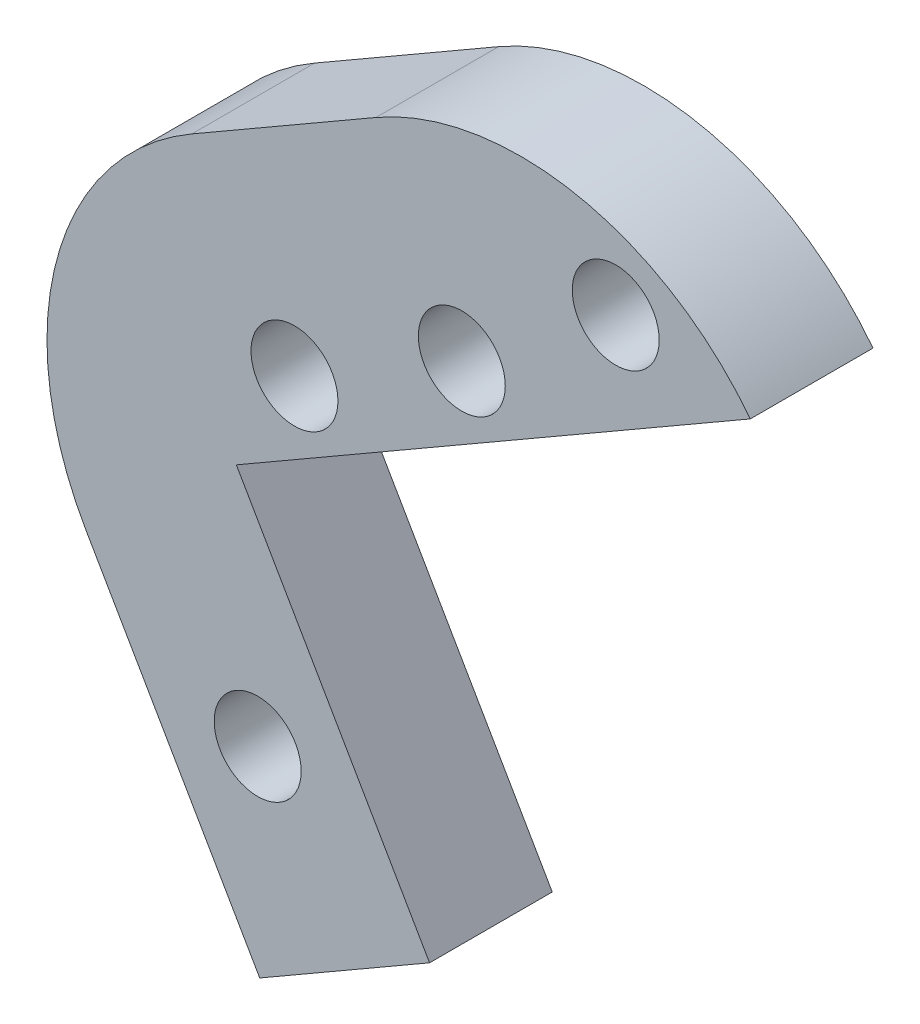
ISO-10303-21;
HEADER;
FILE_DESCRIPTION(('STEP AP214'),'2;1');
FILE_NAME('part.step','',(''),(''),'','','');
FILE_SCHEMA(('AUTOMOTIVE_DESIGN { 1 0 10303 214 1 1 1 1 }'));
ENDSEC;
DATA;
#1=APPLICATION_CONTEXT('core data for automotive mechanical design processes');
#2=APPLICATION_PROTOCOL_DEFINITION('international standard','automotive_design',2000,#1);
#3=PRODUCT_CONTEXT('',#1,'mechanical');
#4=PRODUCT('Part','Part','',(#3));
#5=PRODUCT_RELATED_PRODUCT_CATEGORY('part','',(#4));
#6=PRODUCT_DEFINITION_FORMATION('','',#4);
#7=PRODUCT_DEFINITION_CONTEXT('part definition',#1,'design');
#8=PRODUCT_DEFINITION('design','',#6,#7);
#9=PRODUCT_DEFINITION_SHAPE('','',#8);
#10=(LENGTH_UNIT() NAMED_UNIT(*) SI_UNIT(.MILLI.,.METRE.));
#11=(NAMED_UNIT(*) PLANE_ANGLE_UNIT() SI_UNIT($,.RADIAN.));
#12=(NAMED_UNIT(*) SI_UNIT($,.STERADIAN.) SOLID_ANGLE_UNIT());
#13=UNCERTAINTY_MEASURE_WITH_UNIT(LENGTH_MEASURE(1.E-05),#10,'distance_accuracy_value','');
#14=(GEOMETRIC_REPRESENTATION_CONTEXT(3) GLOBAL_UNCERTAINTY_ASSIGNED_CONTEXT((#13)) GLOBAL_UNIT_ASSIGNED_CONTEXT((#10,
#11,#12)) REPRESENTATION_CONTEXT('',''));
#15=CARTESIAN_POINT('',(0.,0.,0.));
#16=DIRECTION('',(0.,0.,1.));
#17=DIRECTION('',(1.,0.,0.));
#18=AXIS2_PLACEMENT_3D('',#15,#16,#17);
#19=CARTESIAN_POINT('',(0.,0.,-6.35));
#20=DIRECTION('',(0.,0.,1.));
#21=DIRECTION('',(1.,0.,0.));
#22=AXIS2_PLACEMENT_3D('',#19,#20,#21);
#23=PLANE('',#22);
#24=CARTESIAN_POINT('',(-91.104921075794,46.2528903091734,-6.35));
#25=DIRECTION('',(0.,0.,1.));
#26=DIRECTION('',(1.,0.,0.));
#27=AXIS2_PLACEMENT_3D('',#24,#25,#26);
#28=CIRCLE('',#27,2.25);
#29=CARTESIAN_POINT('',(-88.854921075794,46.2528903091734,-6.35));
#30=VERTEX_POINT('',#29);
#31=EDGE_CURVE('E203',#30,#30,#28,.T.);
#32=ORIENTED_EDGE('',*,*,#31,.T.);
#33=EDGE_LOOP('',(#32));
#34=FACE_BOUND('',#33,.T.);
#35=CARTESIAN_POINT('',(-72.5740227754547,74.8495677760783,-6.35));
#36=DIRECTION('',(0.,0.,1.));
#37=DIRECTION('',(1.,0.,0.));
#38=AXIS2_PLACEMENT_3D('',#35,#36,#37);
#39=CIRCLE('',#38,2.25);
#40=CARTESIAN_POINT('',(-70.3240227754547,74.8495677760783,-6.35));
#41=VERTEX_POINT('',#40);
#42=EDGE_CURVE('E212',#41,#41,#39,.T.);
#43=ORIENTED_EDGE('',*,*,#42,.T.);
#44=EDGE_LOOP('',(#43));
#45=FACE_BOUND('',#44,.T.);
#46=CARTESIAN_POINT('',(-89.2016062413413,63.8062523131016,-6.35));
#47=DIRECTION('',(0.,0.,1.));
#48=DIRECTION('',(1.,0.,0.));
#49=AXIS2_PLACEMENT_3D('',#46,#47,#48);
#50=CIRCLE('',#49,2.25);
#51=CARTESIAN_POINT('',(-86.9516062413413,63.8062523131016,-6.35));
#52=VERTEX_POINT('',#51);
#53=EDGE_CURVE('E171',#52,#52,#50,.T.);
#54=ORIENTED_EDGE('',*,*,#53,.T.);
#55=EDGE_LOOP('',(#54));
#56=FACE_BOUND('',#55,.T.);
#57=CARTESIAN_POINT('',(-80.5413522034969,68.8062523131016,-6.35));
#58=DIRECTION('',(0.,0.,1.));
#59=DIRECTION('',(1.,0.,0.));
#60=AXIS2_PLACEMENT_3D('',#57,#58,#59);
#61=CIRCLE('',#60,2.25);
#62=CARTESIAN_POINT('',(-78.2913522034969,68.8062523131016,-6.35));
#63=VERTEX_POINT('',#62);
#64=EDGE_CURVE('E165',#63,#63,#61,.T.);
#65=ORIENTED_EDGE('',*,*,#64,.T.);
#66=EDGE_LOOP('',(#65));
#67=FACE_BOUND('',#66,.T.);
#68=CARTESIAN_POINT('',(-77.4833395016047,64.5096189432334,-6.35));
#69=DIRECTION('',(0.,0.,1.));
#70=DIRECTION('',(1.,0.,0.));
#71=AXIS2_PLACEMENT_3D('',#68,#69,#70);
#72=CIRCLE('',#71,15.);
#73=CARTESIAN_POINT('',(-84.9833395016048,77.4999999999999,-6.35));
#74=VERTEX_POINT('',#73);
#75=CARTESIAN_POINT('',(-65.6089463120209,73.6747041244615,-6.35));
#76=VERTEX_POINT('',#75);
#77=EDGE_CURVE('E143',#74,#76,#72,.F.);
#78=ORIENTED_EDGE('',*,*,#77,.T.);
#79=DIRECTION('',(-0.866025403784438,-0.500000000000001,0.));
#80=VECTOR('',#79,1.);
#81=CARTESIAN_POINT('',(-74.2831162932502,68.6666697508022,-6.35));
#82=LINE('',#81,#80);
#83=CARTESIAN_POINT('',(-92.209842151588,58.3166697508022,-6.35));
#84=VERTEX_POINT('',#83);
#85=EDGE_CURVE('E188',#76,#84,#82,.T.);
#86=ORIENTED_EDGE('',*,*,#85,.T.);
#87=DIRECTION('',(0.5,-0.866025403784438,0.));
#88=VECTOR('',#87,1.);
#89=CARTESIAN_POINT('',(-92.209842151588,58.3166697508022,-6.35));
#90=LINE('',#89,#88);
#91=CARTESIAN_POINT('',(-82.209842151588,40.9961616751134,-6.35));
#92=VERTEX_POINT('',#91);
#93=EDGE_CURVE('E111',#84,#92,#90,.T.);
#94=ORIENTED_EDGE('',*,*,#93,.T.);
#95=DIRECTION('',(0.866025403784439,0.499999999999999,0.));
#96=VECTOR('',#95,1.);
#97=CARTESIAN_POINT('',(-82.209842151588,40.9961616751134,-6.35));
#98=LINE('',#97,#96);
#99=CARTESIAN_POINT('',(-91.0000000000001,35.9211616751134,-6.35));
#100=VERTEX_POINT('',#99);
#101=EDGE_CURVE('E53',#100,#92,#98,.T.);
#102=ORIENTED_EDGE('',*,*,#101,.F.);
#103=DIRECTION('',(0.500000000000005,-0.866025403784436,0.));
#104=VECTOR('',#103,1.);
#105=CARTESIAN_POINT('',(-107.5,64.4999999999998,-6.35));
#106=LINE('',#105,#104);
#107=CARTESIAN_POINT('',(-100.,51.5096189432333,-6.35));
#108=VERTEX_POINT('',#107);
#109=EDGE_CURVE('E108',#108,#100,#106,.T.);
#110=ORIENTED_EDGE('',*,*,#109,.F.);
#111=CARTESIAN_POINT('',(-87.0096189432335,59.0096189432333,-6.35));
#112=DIRECTION('',(0.,0.,1.));
#113=DIRECTION('',(1.,0.,0.));
#114=AXIS2_PLACEMENT_3D('',#111,#112,#113);
#115=CIRCLE('',#114,15.);
#116=CARTESIAN_POINT('',(-94.5096189432336,71.9999999999999,-6.35));
#117=VERTEX_POINT('',#116);
#118=EDGE_CURVE('E61',#108,#117,#115,.F.);
#119=ORIENTED_EDGE('',*,*,#118,.T.);
#120=DIRECTION('',(-0.866025403784435,-0.500000000000006,0.));
#121=VECTOR('',#120,1.);
#122=CARTESIAN_POINT('',(-71.9929584448382,85.,-6.35));
#123=LINE('',#122,#121);
#124=EDGE_CURVE('E116',#74,#117,#123,.T.);
#125=ORIENTED_EDGE('',*,*,#124,.F.);
#126=EDGE_LOOP('',(#78,#86,#94,#102,#110,#119,#125));
#127=FACE_BOUND('',#126,.T.);
#128=ADVANCED_FACE('F38',(#34,#45,#56,#67,#127),#23,.F.);
#129=CARTESIAN_POINT('',(0.,0.,0.));
#130=DIRECTION('',(0.,0.,1.));
#131=DIRECTION('',(1.,0.,0.));
#132=AXIS2_PLACEMENT_3D('',#129,#130,#131);
#133=PLANE('',#132);
#134=CARTESIAN_POINT('',(-91.104921075794,46.2528903091734,0.));
#135=DIRECTION('',(0.,0.,1.));
#136=DIRECTION('',(1.,0.,0.));
#137=AXIS2_PLACEMENT_3D('',#134,#135,#136);
#138=CIRCLE('',#137,2.25);
#139=CARTESIAN_POINT('',(-88.854921075794,46.2528903091734,0.));
#140=VERTEX_POINT('',#139);
#141=EDGE_CURVE('E206',#140,#140,#138,.T.);
#142=ORIENTED_EDGE('',*,*,#141,.F.);
#143=EDGE_LOOP('',(#142));
#144=FACE_BOUND('',#143,.T.);
#145=CARTESIAN_POINT('',(-72.5740227754547,74.8495677760783,0.));
#146=DIRECTION('',(0.,0.,1.));
#147=DIRECTION('',(1.,0.,0.));
#148=AXIS2_PLACEMENT_3D('',#145,#146,#147);
#149=CIRCLE('',#148,2.25);
#150=CARTESIAN_POINT('',(-70.3240227754547,74.8495677760783,0.));
#151=VERTEX_POINT('',#150);
#152=EDGE_CURVE('E217',#151,#151,#149,.T.);
#153=ORIENTED_EDGE('',*,*,#152,.F.);
#154=EDGE_LOOP('',(#153));
#155=FACE_BOUND('',#154,.T.);
#156=CARTESIAN_POINT('',(-89.2016062413413,63.8062523131016,0.));
#157=DIRECTION('',(0.,0.,1.));
#158=DIRECTION('',(1.,0.,0.));
#159=AXIS2_PLACEMENT_3D('',#156,#157,#158);
#160=CIRCLE('',#159,2.25);
#161=CARTESIAN_POINT('',(-86.9516062413413,63.8062523131016,0.));
#162=VERTEX_POINT('',#161);
#163=EDGE_CURVE('E175',#162,#162,#160,.T.);
#164=ORIENTED_EDGE('',*,*,#163,.F.);
#165=EDGE_LOOP('',(#164));
#166=FACE_BOUND('',#165,.T.);
#167=CARTESIAN_POINT('',(-80.5413522034969,68.8062523131016,0.));
#168=DIRECTION('',(0.,0.,1.));
#169=DIRECTION('',(1.,0.,0.));
#170=AXIS2_PLACEMENT_3D('',#167,#168,#169);
#171=CIRCLE('',#170,2.25);
#172=CARTESIAN_POINT('',(-78.2913522034969,68.8062523131016,0.));
#173=VERTEX_POINT('',#172);
#174=EDGE_CURVE('E161',#173,#173,#171,.T.);
#175=ORIENTED_EDGE('',*,*,#174,.F.);
#176=EDGE_LOOP('',(#175));
#177=FACE_BOUND('',#176,.T.);
#178=DIRECTION('',(-0.866025403784438,-0.500000000000001,0.));
#179=VECTOR('',#178,1.);
#180=CARTESIAN_POINT('',(-74.2831162932502,68.6666697508022,0.));
#181=LINE('',#180,#179);
#182=CARTESIAN_POINT('',(-65.6089463120209,73.6747041244615,0.));
#183=VERTEX_POINT('',#182);
#184=CARTESIAN_POINT('',(-92.209842151588,58.3166697508022,0.));
#185=VERTEX_POINT('',#184);
#186=EDGE_CURVE('E174',#183,#185,#181,.T.);
#187=ORIENTED_EDGE('',*,*,#186,.F.);
#188=CARTESIAN_POINT('',(-77.4833395016047,64.5096189432334,0.));
#189=DIRECTION('',(0.,0.,1.));
#190=DIRECTION('',(1.,0.,0.));
#191=AXIS2_PLACEMENT_3D('',#188,#189,#190);
#192=CIRCLE('',#191,15.);
#193=CARTESIAN_POINT('',(-84.9833395016048,77.4999999999999,0.));
#194=VERTEX_POINT('',#193);
#195=EDGE_CURVE('E119',#183,#194,#192,.T.);
#196=ORIENTED_EDGE('',*,*,#195,.T.);
#197=DIRECTION('',(-0.866025403784435,-0.500000000000006,0.));
#198=VECTOR('',#197,1.);
#199=CARTESIAN_POINT('',(-71.9929584448382,85.,0.));
#200=LINE('',#199,#198);
#201=CARTESIAN_POINT('',(-94.5096189432336,71.9999999999999,0.));
#202=VERTEX_POINT('',#201);
#203=EDGE_CURVE('E125',#194,#202,#200,.T.);
#204=ORIENTED_EDGE('',*,*,#203,.T.);
#205=CARTESIAN_POINT('',(-87.0096189432335,59.0096189432333,0.));
#206=DIRECTION('',(0.,0.,1.));
#207=DIRECTION('',(1.,0.,0.));
#208=AXIS2_PLACEMENT_3D('',#205,#206,#207);
#209=CIRCLE('',#208,15.);
#210=CARTESIAN_POINT('',(-100.,51.5096189432333,0.));
#211=VERTEX_POINT('',#210);
#212=EDGE_CURVE('E115',#202,#211,#209,.T.);
#213=ORIENTED_EDGE('',*,*,#212,.T.);
#214=DIRECTION('',(0.500000000000005,-0.866025403784436,0.));
#215=VECTOR('',#214,1.);
#216=CARTESIAN_POINT('',(-107.5,64.4999999999998,0.));
#217=LINE('',#216,#215);
#218=CARTESIAN_POINT('',(-91.0000000000001,35.9211616751134,0.));
#219=VERTEX_POINT('',#218);
#220=EDGE_CURVE('E121',#211,#219,#217,.T.);
#221=ORIENTED_EDGE('',*,*,#220,.T.);
#222=DIRECTION('',(0.866025403784439,0.499999999999999,0.));
#223=VECTOR('',#222,1.);
#224=CARTESIAN_POINT('',(-82.209842151588,40.9961616751134,0.));
#225=LINE('',#224,#223);
#226=CARTESIAN_POINT('',(-82.209842151588,40.9961616751134,0.));
#227=VERTEX_POINT('',#226);
#228=EDGE_CURVE('E99',#219,#227,#225,.T.);
#229=ORIENTED_EDGE('',*,*,#228,.T.);
#230=DIRECTION('',(0.5,-0.866025403784438,0.));
#231=VECTOR('',#230,1.);
#232=CARTESIAN_POINT('',(-92.209842151588,58.3166697508022,0.));
#233=LINE('',#232,#231);
#234=EDGE_CURVE('E190',#185,#227,#233,.T.);
#235=ORIENTED_EDGE('',*,*,#234,.F.);
#236=EDGE_LOOP('',(#187,#196,#204,#213,#221,#229,#235));
#237=FACE_BOUND('',#236,.T.);
#238=ADVANCED_FACE('F201',(#144,#155,#166,#177,#237),#133,.T.);
#239=CARTESIAN_POINT('',(-107.5,64.4999999999998,-6.35));
#240=DIRECTION('',(-0.866025403784436,-0.500000000000005,0.));
#241=DIRECTION('',(0.500000000000005,-0.866025403784436,0.));
#242=AXIS2_PLACEMENT_3D('',#239,#240,#241);
#243=PLANE('',#242);
#244=ORIENTED_EDGE('',*,*,#109,.T.);
#245=DIRECTION('',(0.,0.,1.));
#246=VECTOR('',#245,1.);
#247=CARTESIAN_POINT('',(-91.0000000000001,35.9211616751134,-6.35));
#248=LINE('',#247,#246);
#249=EDGE_CURVE('E96',#100,#219,#248,.T.);
#250=ORIENTED_EDGE('',*,*,#249,.T.);
#251=ORIENTED_EDGE('',*,*,#220,.F.);
#252=DIRECTION('',(0.,0.,1.));
#253=VECTOR('',#252,1.);
#254=CARTESIAN_POINT('',(-100.,51.5096189432333,-6.35));
#255=LINE('',#254,#253);
#256=EDGE_CURVE('E13',#211,#108,#255,.F.);
#257=ORIENTED_EDGE('',*,*,#256,.T.);
#258=EDGE_LOOP('',(#244,#250,#251,#257));
#259=FACE_BOUND('',#258,.T.);
#260=ADVANCED_FACE('F113',(#259),#243,.T.);
#261=CARTESIAN_POINT('',(-77.4833395016047,64.5096189432334,-6.35));
#262=DIRECTION('',(0.,0.,1.));
#263=DIRECTION('',(1.,0.,0.));
#264=AXIS2_PLACEMENT_3D('',#261,#262,#263);
#265=CYLINDRICAL_SURFACE('',#264,15.);
#266=ORIENTED_EDGE('',*,*,#195,.F.);
#267=DIRECTION('',(0.,0.,1.));
#268=VECTOR('',#267,1.);
#269=CARTESIAN_POINT('',(-65.6089463120209,73.6747041244615,-6.35));
#270=LINE('',#269,#268);
#271=EDGE_CURVE('E158',#76,#183,#270,.T.);
#272=ORIENTED_EDGE('',*,*,#271,.F.);
#273=ORIENTED_EDGE('',*,*,#77,.F.);
#274=DIRECTION('',(0.,0.,1.));
#275=VECTOR('',#274,1.);
#276=CARTESIAN_POINT('',(-84.9833395016048,77.4999999999999,-6.35));
#277=LINE('',#276,#275);
#278=EDGE_CURVE('E46',#194,#74,#277,.F.);
#279=ORIENTED_EDGE('',*,*,#278,.F.);
#280=EDGE_LOOP('',(#266,#272,#273,#279));
#281=FACE_BOUND('',#280,.T.);
#282=ADVANCED_FACE('F156',(#281),#265,.T.);
#283=CARTESIAN_POINT('',(-92.209842151588,58.3166697508022,-6.35));
#284=DIRECTION('',(-0.866025403784438,-0.5,0.));
#285=DIRECTION('',(0.5,-0.866025403784438,0.));
#286=AXIS2_PLACEMENT_3D('',#283,#284,#285);
#287=PLANE('',#286);
#288=DIRECTION('',(0.,0.,1.));
#289=VECTOR('',#288,1.);
#290=CARTESIAN_POINT('',(-82.209842151588,40.9961616751134,-6.35));
#291=LINE('',#290,#289);
#292=EDGE_CURVE('E104',#92,#227,#291,.T.);
#293=ORIENTED_EDGE('',*,*,#292,.F.);
#294=ORIENTED_EDGE('',*,*,#93,.F.);
#295=DIRECTION('',(0.,0.,1.));
#296=VECTOR('',#295,1.);
#297=CARTESIAN_POINT('',(-92.209842151588,58.3166697508022,-6.35));
#298=LINE('',#297,#296);
#299=EDGE_CURVE('E130',#84,#185,#298,.T.);
#300=ORIENTED_EDGE('',*,*,#299,.T.);
#301=ORIENTED_EDGE('',*,*,#234,.T.);
#302=EDGE_LOOP('',(#293,#294,#300,#301));
#303=FACE_BOUND('',#302,.T.);
#304=ADVANCED_FACE('F197',(#303),#287,.F.);
#305=CARTESIAN_POINT('',(-71.9929584448382,85.,-6.35));
#306=DIRECTION('',(-0.500000000000006,0.866025403784435,0.));
#307=DIRECTION('',(-0.866025403784435,-0.500000000000006,0.));
#308=AXIS2_PLACEMENT_3D('',#305,#306,#307);
#309=PLANE('',#308);
#310=ORIENTED_EDGE('',*,*,#203,.F.);
#311=ORIENTED_EDGE('',*,*,#278,.T.);
#312=ORIENTED_EDGE('',*,*,#124,.T.);
#313=DIRECTION('',(0.,0.,1.));
#314=VECTOR('',#313,1.);
#315=CARTESIAN_POINT('',(-94.5096189432336,71.9999999999999,-6.35));
#316=LINE('',#315,#314);
#317=EDGE_CURVE('E145',#117,#202,#316,.T.);
#318=ORIENTED_EDGE('',*,*,#317,.T.);
#319=EDGE_LOOP('',(#310,#311,#312,#318));
#320=FACE_BOUND('',#319,.T.);
#321=ADVANCED_FACE('F150',(#320),#309,.T.);
#322=CARTESIAN_POINT('',(-87.0096189432335,59.0096189432333,-6.35));
#323=DIRECTION('',(0.,0.,1.));
#324=DIRECTION('',(1.,0.,0.));
#325=AXIS2_PLACEMENT_3D('',#322,#323,#324);
#326=CYLINDRICAL_SURFACE('',#325,15.);
#327=ORIENTED_EDGE('',*,*,#118,.F.);
#328=ORIENTED_EDGE('',*,*,#256,.F.);
#329=ORIENTED_EDGE('',*,*,#212,.F.);
#330=ORIENTED_EDGE('',*,*,#317,.F.);
#331=EDGE_LOOP('',(#327,#328,#329,#330));
#332=FACE_BOUND('',#331,.T.);
#333=ADVANCED_FACE('F40',(#332),#326,.T.);
#334=CARTESIAN_POINT('',(-74.2831162932502,68.6666697508022,-6.35));
#335=DIRECTION('',(-0.500000000000001,0.866025403784438,0.));
#336=DIRECTION('',(-0.866025403784438,-0.500000000000001,0.));
#337=AXIS2_PLACEMENT_3D('',#334,#335,#336);
#338=PLANE('',#337);
#339=ORIENTED_EDGE('',*,*,#186,.T.);
#340=ORIENTED_EDGE('',*,*,#299,.F.);
#341=ORIENTED_EDGE('',*,*,#85,.F.);
#342=ORIENTED_EDGE('',*,*,#271,.T.);
#343=EDGE_LOOP('',(#339,#340,#341,#342));
#344=FACE_BOUND('',#343,.T.);
#345=ADVANCED_FACE('F199',(#344),#338,.F.);
#346=CARTESIAN_POINT('',(-89.2016062413413,63.8062523131016,-6.35));
#347=DIRECTION('',(0.,0.,1.));
#348=DIRECTION('',(1.,0.,0.));
#349=AXIS2_PLACEMENT_3D('',#346,#347,#348);
#350=CYLINDRICAL_SURFACE('',#349,2.25);
#351=ORIENTED_EDGE('',*,*,#53,.F.);
#352=EDGE_LOOP('',(#351));
#353=FACE_BOUND('',#352,.T.);
#354=ORIENTED_EDGE('',*,*,#163,.T.);
#355=EDGE_LOOP('',(#354));
#356=FACE_BOUND('',#355,.T.);
#357=ADVANCED_FACE('F235',(#353,#356),#350,.F.);
#358=CARTESIAN_POINT('',(-80.5413522034969,68.8062523131016,-6.35));
#359=DIRECTION('',(0.,0.,1.));
#360=DIRECTION('',(1.,0.,0.));
#361=AXIS2_PLACEMENT_3D('',#358,#359,#360);
#362=CYLINDRICAL_SURFACE('',#361,2.25);
#363=ORIENTED_EDGE('',*,*,#64,.F.);
#364=EDGE_LOOP('',(#363));
#365=FACE_BOUND('',#364,.T.);
#366=ORIENTED_EDGE('',*,*,#174,.T.);
#367=EDGE_LOOP('',(#366));
#368=FACE_BOUND('',#367,.T.);
#369=ADVANCED_FACE('F233',(#365,#368),#362,.F.);
#370=CARTESIAN_POINT('',(-82.209842151588,40.9961616751134,-6.35));
#371=DIRECTION('',(0.499999999999999,-0.866025403784439,0.));
#372=DIRECTION('',(0.866025403784439,0.499999999999999,0.));
#373=AXIS2_PLACEMENT_3D('',#370,#371,#372);
#374=PLANE('',#373);
#375=ORIENTED_EDGE('',*,*,#228,.F.);
#376=ORIENTED_EDGE('',*,*,#249,.F.);
#377=ORIENTED_EDGE('',*,*,#101,.T.);
#378=ORIENTED_EDGE('',*,*,#292,.T.);
#379=EDGE_LOOP('',(#375,#376,#377,#378));
#380=FACE_BOUND('',#379,.T.);
#381=ADVANCED_FACE('F97',(#380),#374,.T.);
#382=CARTESIAN_POINT('',(-72.5740227754547,74.8495677760783,-6.35));
#383=DIRECTION('',(0.,0.,1.));
#384=DIRECTION('',(1.,0.,0.));
#385=AXIS2_PLACEMENT_3D('',#382,#383,#384);
#386=CYLINDRICAL_SURFACE('',#385,2.25);
#387=ORIENTED_EDGE('',*,*,#42,.F.);
#388=EDGE_LOOP('',(#387));
#389=FACE_BOUND('',#388,.T.);
#390=ORIENTED_EDGE('',*,*,#152,.T.);
#391=EDGE_LOOP('',(#390));
#392=FACE_BOUND('',#391,.T.);
#393=ADVANCED_FACE('F223',(#389,#392),#386,.F.);
#394=CARTESIAN_POINT('',(-91.104921075794,46.2528903091734,-6.35));
#395=DIRECTION('',(0.,0.,1.));
#396=DIRECTION('',(1.,0.,0.));
#397=AXIS2_PLACEMENT_3D('',#394,#395,#396);
#398=CYLINDRICAL_SURFACE('',#397,2.25);
#399=ORIENTED_EDGE('',*,*,#31,.F.);
#400=EDGE_LOOP('',(#399));
#401=FACE_BOUND('',#400,.T.);
#402=ORIENTED_EDGE('',*,*,#141,.T.);
#403=EDGE_LOOP('',(#402));
#404=FACE_BOUND('',#403,.T.);
#405=ADVANCED_FACE('F287',(#401,#404),#398,.F.);
#406=CLOSED_SHELL('',(#128,#238,#260,#282,#304,#321,#333,#345,#357,#369,#381,#393,#405));
#407=MANIFOLD_SOLID_BREP('B2',#406);
#408=ADVANCED_BREP_SHAPE_REPRESENTATION('',(#18,#407),#14);
#409=SHAPE_DEFINITION_REPRESENTATION(#9,#408);
ENDSEC;
END-ISO-10303-21;
